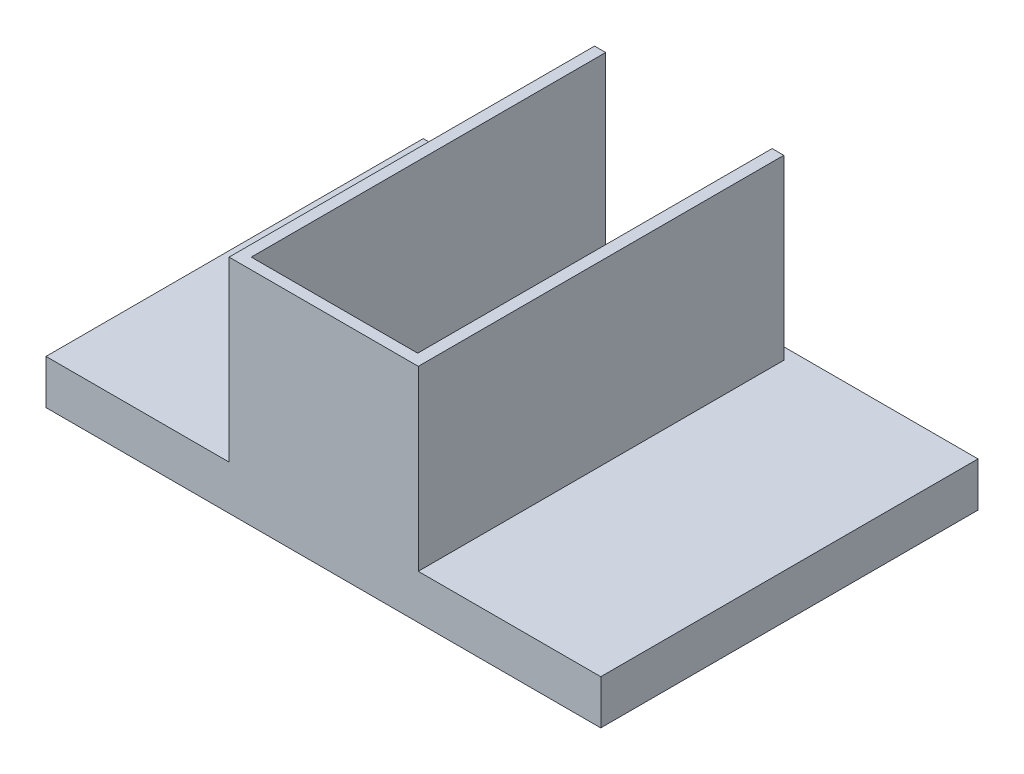
ISO-10303-21;
HEADER;
FILE_DESCRIPTION(('STEP AP214'),'2;1');
FILE_NAME('part.step','',(''),(''),'','','');
FILE_SCHEMA(('AUTOMOTIVE_DESIGN { 1 0 10303 214 1 1 1 1 }'));
ENDSEC;
DATA;
#1=APPLICATION_CONTEXT('core data for automotive mechanical design processes');
#2=APPLICATION_PROTOCOL_DEFINITION('international standard','automotive_design',2000,#1);
#3=PRODUCT_CONTEXT('',#1,'mechanical');
#4=PRODUCT('Part','Part','',(#3));
#5=PRODUCT_RELATED_PRODUCT_CATEGORY('part','',(#4));
#6=PRODUCT_DEFINITION_FORMATION('','',#4);
#7=PRODUCT_DEFINITION_CONTEXT('part definition',#1,'design');
#8=PRODUCT_DEFINITION('design','',#6,#7);
#9=PRODUCT_DEFINITION_SHAPE('','',#8);
#10=(LENGTH_UNIT() NAMED_UNIT(*) SI_UNIT(.MILLI.,.METRE.));
#11=(NAMED_UNIT(*) PLANE_ANGLE_UNIT() SI_UNIT($,.RADIAN.));
#12=(NAMED_UNIT(*) SI_UNIT($,.STERADIAN.) SOLID_ANGLE_UNIT());
#13=UNCERTAINTY_MEASURE_WITH_UNIT(LENGTH_MEASURE(1.E-05),#10,'distance_accuracy_value','');
#14=(GEOMETRIC_REPRESENTATION_CONTEXT(3) GLOBAL_UNCERTAINTY_ASSIGNED_CONTEXT((#13)) GLOBAL_UNIT_ASSIGNED_CONTEXT((#10,
#11,#12)) REPRESENTATION_CONTEXT('',''));
#15=CARTESIAN_POINT('',(0.,0.,0.));
#16=DIRECTION('',(0.,0.,1.));
#17=DIRECTION('',(1.,0.,0.));
#18=AXIS2_PLACEMENT_3D('',#15,#16,#17);
#19=CARTESIAN_POINT('',(-60.7292193154763,5.08,-16.7416663626843));
#20=DIRECTION('',(0.,0.,-1.));
#21=DIRECTION('',(-1.,0.,0.));
#22=AXIS2_PLACEMENT_3D('',#19,#20,#21);
#23=PLANE('',#22);
#24=DIRECTION('',(1.,0.,0.));
#25=VECTOR('',#24,1.);
#26=CARTESIAN_POINT('',(-60.7292193154763,5.08,-16.7416663626843));
#27=LINE('',#26,#25);
#28=CARTESIAN_POINT('',(-60.7292193154763,5.08,-16.7416663626843));
#29=VERTEX_POINT('',#28);
#30=CARTESIAN_POINT('',(2.77078068452374,5.08,-16.7416663626843));
#31=VERTEX_POINT('',#30);
#32=EDGE_CURVE('E125',#29,#31,#27,.T.);
#33=ORIENTED_EDGE('',*,*,#32,.T.);
#34=DIRECTION('',(0.,-1.,0.));
#35=VECTOR('',#34,1.);
#36=CARTESIAN_POINT('',(2.77078068452374,5.08,-16.7416663626843));
#37=LINE('',#36,#35);
#38=CARTESIAN_POINT('',(2.77078068452374,0.,-16.7416663626843));
#39=VERTEX_POINT('',#38);
#40=EDGE_CURVE('E113',#31,#39,#37,.T.);
#41=ORIENTED_EDGE('',*,*,#40,.T.);
#42=DIRECTION('',(1.,0.,0.));
#43=VECTOR('',#42,1.);
#44=CARTESIAN_POINT('',(-60.7292193154763,0.,-16.7416663626843));
#45=LINE('',#44,#43);
#46=CARTESIAN_POINT('',(-60.7292193154763,0.,-16.7416663626843));
#47=VERTEX_POINT('',#46);
#48=EDGE_CURVE('E94',#47,#39,#45,.T.);
#49=ORIENTED_EDGE('',*,*,#48,.F.);
#50=DIRECTION('',(0.,-1.,0.));
#51=VECTOR('',#50,1.);
#52=CARTESIAN_POINT('',(-60.7292193154763,5.08,-16.7416663626843));
#53=LINE('',#52,#51);
#54=EDGE_CURVE('E120',#29,#47,#53,.T.);
#55=ORIENTED_EDGE('',*,*,#54,.F.);
#56=EDGE_LOOP('',(#33,#41,#49,#55));
#57=FACE_BOUND('',#56,.T.);
#58=ADVANCED_FACE('F33',(#57),#23,.T.);
#59=CARTESIAN_POINT('',(0.,5.08,0.));
#60=DIRECTION('',(0.,-1.,0.));
#61=DIRECTION('',(0.,0.,-1.));
#62=AXIS2_PLACEMENT_3D('',#59,#60,#61);
#63=PLANE('',#62);
#64=DIRECTION('',(0.,0.,-1.));
#65=VECTOR('',#64,1.);
#66=CARTESIAN_POINT('',(2.77078068452374,5.08,26.4383336373157));
#67=LINE('',#66,#65);
#68=CARTESIAN_POINT('',(2.77078068452374,5.08,26.4383336373157));
#69=VERTEX_POINT('',#68);
#70=EDGE_CURVE('E89',#69,#31,#67,.T.);
#71=ORIENTED_EDGE('',*,*,#70,.T.);
#72=ORIENTED_EDGE('',*,*,#32,.F.);
#73=DIRECTION('',(0.,0.,1.));
#74=VECTOR('',#73,1.);
#75=CARTESIAN_POINT('',(-60.7292193154763,5.08,26.4383336373157));
#76=LINE('',#75,#74);
#77=CARTESIAN_POINT('',(-60.7292193154763,5.08,26.4383336373157));
#78=VERTEX_POINT('',#77);
#79=EDGE_CURVE('E95',#29,#78,#76,.T.);
#80=ORIENTED_EDGE('',*,*,#79,.T.);
#81=DIRECTION('',(1.,0.,0.));
#82=VECTOR('',#81,1.);
#83=CARTESIAN_POINT('',(-60.7292193154763,5.08,26.4383336373157));
#84=LINE('',#83,#82);
#85=CARTESIAN_POINT('',(-39.7742193154763,5.08,26.4383336373157));
#86=VERTEX_POINT('',#85);
#87=EDGE_CURVE('E101',#78,#86,#84,.T.);
#88=ORIENTED_EDGE('',*,*,#87,.T.);
#89=DIRECTION('',(0.,0.,1.));
#90=VECTOR('',#89,1.);
#91=CARTESIAN_POINT('',(-39.7742193154763,5.08,26.4383336373157));
#92=LINE('',#91,#90);
#93=CARTESIAN_POINT('',(-39.7742193154763,5.08,-15.3995097669461));
#94=VERTEX_POINT('',#93);
#95=EDGE_CURVE('E37',#94,#86,#92,.T.);
#96=ORIENTED_EDGE('',*,*,#95,.F.);
#97=DIRECTION('',(1.,0.,0.));
#98=VECTOR('',#97,1.);
#99=CARTESIAN_POINT('',(-39.7742193154763,5.08,-15.3995097669461));
#100=LINE('',#99,#98);
#101=CARTESIAN_POINT('',(-38.5042193154763,5.08,-15.3995097669461));
#102=VERTEX_POINT('',#101);
#103=EDGE_CURVE('E181',#94,#102,#100,.T.);
#104=ORIENTED_EDGE('',*,*,#103,.T.);
#105=DIRECTION('',(0.,0.,-1.));
#106=VECTOR('',#105,1.);
#107=CARTESIAN_POINT('',(-38.5042193154763,5.08,26.4383336373157));
#108=LINE('',#107,#106);
#109=CARTESIAN_POINT('',(-38.5042193154763,5.08,25.1683336373157));
#110=VERTEX_POINT('',#109);
#111=EDGE_CURVE('E111',#110,#102,#108,.T.);
#112=ORIENTED_EDGE('',*,*,#111,.F.);
#113=DIRECTION('',(1.,0.,0.));
#114=VECTOR('',#113,1.);
#115=CARTESIAN_POINT('',(-38.5042193154763,5.08,25.1683336373157));
#116=LINE('',#115,#114);
#117=CARTESIAN_POINT('',(-19.4542193154763,5.08,25.1683336373157));
#118=VERTEX_POINT('',#117);
#119=EDGE_CURVE('E140',#110,#118,#116,.T.);
#120=ORIENTED_EDGE('',*,*,#119,.T.);
#121=DIRECTION('',(0.,0.,1.));
#122=VECTOR('',#121,1.);
#123=CARTESIAN_POINT('',(-19.4542193154763,5.08,26.4383336373157));
#124=LINE('',#123,#122);
#125=CARTESIAN_POINT('',(-19.4542193154763,5.08,-15.3995097669461));
#126=VERTEX_POINT('',#125);
#127=EDGE_CURVE('E194',#126,#118,#124,.T.);
#128=ORIENTED_EDGE('',*,*,#127,.F.);
#129=CARTESIAN_POINT('',(-18.1182186528872,5.08,-15.3995097669461));
#130=VERTEX_POINT('',#129);
#131=EDGE_CURVE('E177',#126,#130,#100,.T.);
#132=ORIENTED_EDGE('',*,*,#131,.T.);
#133=DIRECTION('',(0.,0.,-1.));
#134=VECTOR('',#133,1.);
#135=CARTESIAN_POINT('',(-18.1182186528872,5.08,26.4383336373157));
#136=LINE('',#135,#134);
#137=CARTESIAN_POINT('',(-18.1182186528872,5.08,26.4383336373157));
#138=VERTEX_POINT('',#137);
#139=EDGE_CURVE('E199',#138,#130,#136,.T.);
#140=ORIENTED_EDGE('',*,*,#139,.F.);
#141=EDGE_CURVE('E59',#138,#69,#84,.T.);
#142=ORIENTED_EDGE('',*,*,#141,.T.);
#143=EDGE_LOOP('',(#71,#72,#80,#88,#96,#104,#112,#120,#128,#132,#140,#142));
#144=FACE_BOUND('',#143,.T.);
#145=ADVANCED_FACE('F211',(#144),#63,.F.);
#146=CARTESIAN_POINT('',(-60.7292193154763,5.08,26.4383336373157));
#147=DIRECTION('',(1.,0.,0.));
#148=DIRECTION('',(0.,0.,-1.));
#149=AXIS2_PLACEMENT_3D('',#146,#147,#148);
#150=PLANE('',#149);
#151=DIRECTION('',(0.,0.,1.));
#152=VECTOR('',#151,1.);
#153=CARTESIAN_POINT('',(-60.7292193154763,0.,26.4383336373157));
#154=LINE('',#153,#152);
#155=CARTESIAN_POINT('',(-60.7292193154763,0.,26.4383336373157));
#156=VERTEX_POINT('',#155);
#157=EDGE_CURVE('E81',#47,#156,#154,.T.);
#158=ORIENTED_EDGE('',*,*,#157,.T.);
#159=DIRECTION('',(0.,-1.,0.));
#160=VECTOR('',#159,1.);
#161=CARTESIAN_POINT('',(-60.7292193154763,5.08,26.4383336373157));
#162=LINE('',#161,#160);
#163=EDGE_CURVE('E11',#78,#156,#162,.T.);
#164=ORIENTED_EDGE('',*,*,#163,.F.);
#165=ORIENTED_EDGE('',*,*,#79,.F.);
#166=ORIENTED_EDGE('',*,*,#54,.T.);
#167=EDGE_LOOP('',(#158,#164,#165,#166));
#168=FACE_BOUND('',#167,.T.);
#169=ADVANCED_FACE('F35',(#168),#150,.F.);
#170=CARTESIAN_POINT('',(-60.7292193154763,5.08,26.4383336373157));
#171=DIRECTION('',(0.,0.,-1.));
#172=DIRECTION('',(-1.,0.,0.));
#173=AXIS2_PLACEMENT_3D('',#170,#171,#172);
#174=PLANE('',#173);
#175=ORIENTED_EDGE('',*,*,#141,.F.);
#176=DIRECTION('',(0.,-1.,0.));
#177=VECTOR('',#176,1.);
#178=CARTESIAN_POINT('',(-18.1182186528872,25.4,26.4383336373157));
#179=LINE('',#178,#177);
#180=CARTESIAN_POINT('',(-18.1182186528872,25.4,26.4383336373157));
#181=VERTEX_POINT('',#180);
#182=EDGE_CURVE('E154',#181,#138,#179,.T.);
#183=ORIENTED_EDGE('',*,*,#182,.F.);
#184=DIRECTION('',(-1.,0.,0.));
#185=VECTOR('',#184,1.);
#186=CARTESIAN_POINT('',(-38.5042193154763,25.4,26.4383336373157));
#187=LINE('',#186,#185);
#188=CARTESIAN_POINT('',(-39.7742193154763,25.4,26.4383336373157));
#189=VERTEX_POINT('',#188);
#190=EDGE_CURVE('E137',#181,#189,#187,.T.);
#191=ORIENTED_EDGE('',*,*,#190,.T.);
#192=DIRECTION('',(0.,-1.,0.));
#193=VECTOR('',#192,1.);
#194=CARTESIAN_POINT('',(-39.7742193154763,25.4,26.4383336373157));
#195=LINE('',#194,#193);
#196=EDGE_CURVE('E134',#189,#86,#195,.T.);
#197=ORIENTED_EDGE('',*,*,#196,.T.);
#198=ORIENTED_EDGE('',*,*,#87,.F.);
#199=ORIENTED_EDGE('',*,*,#163,.T.);
#200=DIRECTION('',(1.,0.,0.));
#201=VECTOR('',#200,1.);
#202=CARTESIAN_POINT('',(-60.7292193154763,0.,26.4383336373157));
#203=LINE('',#202,#201);
#204=CARTESIAN_POINT('',(2.77078068452374,0.,26.4383336373157));
#205=VERTEX_POINT('',#204);
#206=EDGE_CURVE('E71',#156,#205,#203,.T.);
#207=ORIENTED_EDGE('',*,*,#206,.T.);
#208=DIRECTION('',(0.,-1.,0.));
#209=VECTOR('',#208,1.);
#210=CARTESIAN_POINT('',(2.77078068452374,5.08,26.4383336373157));
#211=LINE('',#210,#209);
#212=EDGE_CURVE('E43',#69,#205,#211,.T.);
#213=ORIENTED_EDGE('',*,*,#212,.F.);
#214=EDGE_LOOP('',(#175,#183,#191,#197,#198,#199,#207,#213));
#215=FACE_BOUND('',#214,.T.);
#216=ADVANCED_FACE('F73',(#215),#174,.F.);
#217=CARTESIAN_POINT('',(2.77078068452374,5.08,26.4383336373157));
#218=DIRECTION('',(-1.,0.,0.));
#219=DIRECTION('',(0.,0.,1.));
#220=AXIS2_PLACEMENT_3D('',#217,#218,#219);
#221=PLANE('',#220);
#222=DIRECTION('',(0.,0.,-1.));
#223=VECTOR('',#222,1.);
#224=CARTESIAN_POINT('',(2.77078068452374,0.,26.4383336373157));
#225=LINE('',#224,#223);
#226=EDGE_CURVE('E80',#205,#39,#225,.T.);
#227=ORIENTED_EDGE('',*,*,#226,.T.);
#228=ORIENTED_EDGE('',*,*,#40,.F.);
#229=ORIENTED_EDGE('',*,*,#70,.F.);
#230=ORIENTED_EDGE('',*,*,#212,.T.);
#231=EDGE_LOOP('',(#227,#228,#229,#230));
#232=FACE_BOUND('',#231,.T.);
#233=ADVANCED_FACE('F85',(#232),#221,.F.);
#234=CARTESIAN_POINT('',(0.,0.,0.));
#235=DIRECTION('',(0.,-1.,0.));
#236=DIRECTION('',(0.,0.,-1.));
#237=AXIS2_PLACEMENT_3D('',#234,#235,#236);
#238=PLANE('',#237);
#239=ORIENTED_EDGE('',*,*,#157,.F.);
#240=ORIENTED_EDGE('',*,*,#48,.T.);
#241=ORIENTED_EDGE('',*,*,#226,.F.);
#242=ORIENTED_EDGE('',*,*,#206,.F.);
#243=EDGE_LOOP('',(#239,#240,#241,#242));
#244=FACE_BOUND('',#243,.T.);
#245=ADVANCED_FACE('F92',(#244),#238,.T.);
#246=CARTESIAN_POINT('',(-38.5042193154763,25.4,25.1683336373157));
#247=DIRECTION('',(0.,1.,0.));
#248=DIRECTION('',(-1.,0.,0.));
#249=AXIS2_PLACEMENT_3D('',#246,#247,#248);
#250=PLANE('',#249);
#251=DIRECTION('',(1.,0.,0.));
#252=VECTOR('',#251,1.);
#253=CARTESIAN_POINT('',(-39.7742193154763,25.4,-15.3995097669461));
#254=LINE('',#253,#252);
#255=CARTESIAN_POINT('',(-39.7742193154763,25.4,-15.3995097669461));
#256=VERTEX_POINT('',#255);
#257=CARTESIAN_POINT('',(-38.5042193154763,25.4,-15.3995097669461));
#258=VERTEX_POINT('',#257);
#259=EDGE_CURVE('E172',#256,#258,#254,.T.);
#260=ORIENTED_EDGE('',*,*,#259,.F.);
#261=DIRECTION('',(0.,0.,1.));
#262=VECTOR('',#261,1.);
#263=CARTESIAN_POINT('',(-39.7742193154763,25.4,26.4383336373157));
#264=LINE('',#263,#262);
#265=EDGE_CURVE('E131',#256,#189,#264,.T.);
#266=ORIENTED_EDGE('',*,*,#265,.T.);
#267=ORIENTED_EDGE('',*,*,#190,.F.);
#268=DIRECTION('',(0.,0.,-1.));
#269=VECTOR('',#268,1.);
#270=CARTESIAN_POINT('',(-18.1182186528872,25.4,26.4383336373157));
#271=LINE('',#270,#269);
#272=CARTESIAN_POINT('',(-18.1182186528872,25.4,-15.3995097669461));
#273=VERTEX_POINT('',#272);
#274=EDGE_CURVE('E198',#181,#273,#271,.T.);
#275=ORIENTED_EDGE('',*,*,#274,.T.);
#276=CARTESIAN_POINT('',(-19.4542193154763,25.4,-15.3995097669461));
#277=VERTEX_POINT('',#276);
#278=EDGE_CURVE('E178',#277,#273,#254,.T.);
#279=ORIENTED_EDGE('',*,*,#278,.F.);
#280=DIRECTION('',(0.,0.,1.));
#281=VECTOR('',#280,1.);
#282=CARTESIAN_POINT('',(-19.4542193154763,25.4,26.4383336373157));
#283=LINE('',#282,#281);
#284=CARTESIAN_POINT('',(-19.4542193154763,25.4,25.1683336373157));
#285=VERTEX_POINT('',#284);
#286=EDGE_CURVE('E195',#277,#285,#283,.T.);
#287=ORIENTED_EDGE('',*,*,#286,.T.);
#288=DIRECTION('',(-1.,0.,0.));
#289=VECTOR('',#288,1.);
#290=CARTESIAN_POINT('',(-38.5042193154763,25.4,25.1683336373157));
#291=LINE('',#290,#289);
#292=CARTESIAN_POINT('',(-38.5042193154763,25.4,25.1683336373157));
#293=VERTEX_POINT('',#292);
#294=EDGE_CURVE('E146',#285,#293,#291,.T.);
#295=ORIENTED_EDGE('',*,*,#294,.T.);
#296=DIRECTION('',(0.,0.,-1.));
#297=VECTOR('',#296,1.);
#298=CARTESIAN_POINT('',(-38.5042193154763,25.4,26.4383336373157));
#299=LINE('',#298,#297);
#300=EDGE_CURVE('E119',#293,#258,#299,.T.);
#301=ORIENTED_EDGE('',*,*,#300,.T.);
#302=EDGE_LOOP('',(#260,#266,#267,#275,#279,#287,#295,#301));
#303=FACE_BOUND('',#302,.T.);
#304=ADVANCED_FACE('F170',(#303),#250,.T.);
#305=CARTESIAN_POINT('',(0.,0.,25.1683336373157));
#306=DIRECTION('',(0.,0.,-1.));
#307=DIRECTION('',(-1.,0.,0.));
#308=AXIS2_PLACEMENT_3D('',#305,#306,#307);
#309=PLANE('',#308);
#310=DIRECTION('',(0.,-1.,0.));
#311=VECTOR('',#310,1.);
#312=CARTESIAN_POINT('',(-38.5042193154763,5.08,25.1683336373157));
#313=LINE('',#312,#311);
#314=EDGE_CURVE('E138',#293,#110,#313,.T.);
#315=ORIENTED_EDGE('',*,*,#314,.F.);
#316=ORIENTED_EDGE('',*,*,#294,.F.);
#317=DIRECTION('',(0.,1.,0.));
#318=VECTOR('',#317,1.);
#319=CARTESIAN_POINT('',(-19.4542193154763,5.08,25.1683336373157));
#320=LINE('',#319,#318);
#321=EDGE_CURVE('E143',#118,#285,#320,.T.);
#322=ORIENTED_EDGE('',*,*,#321,.F.);
#323=ORIENTED_EDGE('',*,*,#119,.F.);
#324=EDGE_LOOP('',(#315,#316,#322,#323));
#325=FACE_BOUND('',#324,.T.);
#326=ADVANCED_FACE('F249',(#325),#309,.T.);
#327=CARTESIAN_POINT('',(-38.5042193154763,25.4,26.4383336373157));
#328=DIRECTION('',(-1.,0.,0.));
#329=DIRECTION('',(0.,0.,1.));
#330=AXIS2_PLACEMENT_3D('',#327,#328,#329);
#331=PLANE('',#330);
#332=ORIENTED_EDGE('',*,*,#111,.T.);
#333=DIRECTION('',(0.,1.,0.));
#334=VECTOR('',#333,1.);
#335=CARTESIAN_POINT('',(-38.5042193154763,25.4,-15.3995097669461));
#336=LINE('',#335,#334);
#337=EDGE_CURVE('E192',#102,#258,#336,.T.);
#338=ORIENTED_EDGE('',*,*,#337,.T.);
#339=ORIENTED_EDGE('',*,*,#300,.F.);
#340=ORIENTED_EDGE('',*,*,#314,.T.);
#341=EDGE_LOOP('',(#332,#338,#339,#340));
#342=FACE_BOUND('',#341,.T.);
#343=ADVANCED_FACE('F258',(#342),#331,.F.);
#344=CARTESIAN_POINT('',(-39.7742193154763,25.4,26.4383336373157));
#345=DIRECTION('',(1.,0.,0.));
#346=DIRECTION('',(0.,0.,-1.));
#347=AXIS2_PLACEMENT_3D('',#344,#345,#346);
#348=PLANE('',#347);
#349=ORIENTED_EDGE('',*,*,#265,.F.);
#350=DIRECTION('',(0.,1.,0.));
#351=VECTOR('',#350,1.);
#352=CARTESIAN_POINT('',(-39.7742193154763,5.08,-15.3995097669461));
#353=LINE('',#352,#351);
#354=EDGE_CURVE('E166',#94,#256,#353,.T.);
#355=ORIENTED_EDGE('',*,*,#354,.F.);
#356=ORIENTED_EDGE('',*,*,#95,.T.);
#357=ORIENTED_EDGE('',*,*,#196,.F.);
#358=EDGE_LOOP('',(#349,#355,#356,#357));
#359=FACE_BOUND('',#358,.T.);
#360=ADVANCED_FACE('F162',(#359),#348,.F.);
#361=CARTESIAN_POINT('',(-19.4542193154763,25.4,26.4383336373157));
#362=DIRECTION('',(1.,0.,0.));
#363=DIRECTION('',(0.,0.,-1.));
#364=AXIS2_PLACEMENT_3D('',#361,#362,#363);
#365=PLANE('',#364);
#366=ORIENTED_EDGE('',*,*,#286,.F.);
#367=DIRECTION('',(0.,-1.,0.));
#368=VECTOR('',#367,1.);
#369=CARTESIAN_POINT('',(-19.4542193154763,25.4,-15.3995097669461));
#370=LINE('',#369,#368);
#371=EDGE_CURVE('E188',#277,#126,#370,.T.);
#372=ORIENTED_EDGE('',*,*,#371,.T.);
#373=ORIENTED_EDGE('',*,*,#127,.T.);
#374=ORIENTED_EDGE('',*,*,#321,.T.);
#375=EDGE_LOOP('',(#366,#372,#373,#374));
#376=FACE_BOUND('',#375,.T.);
#377=ADVANCED_FACE('F274',(#376),#365,.F.);
#378=CARTESIAN_POINT('',(-18.1182186528872,25.4,26.4383336373157));
#379=DIRECTION('',(-1.,0.,0.));
#380=DIRECTION('',(0.,0.,1.));
#381=AXIS2_PLACEMENT_3D('',#378,#379,#380);
#382=PLANE('',#381);
#383=ORIENTED_EDGE('',*,*,#139,.T.);
#384=DIRECTION('',(0.,1.,0.));
#385=VECTOR('',#384,1.);
#386=CARTESIAN_POINT('',(-18.1182186528872,5.08,-15.3995097669461));
#387=LINE('',#386,#385);
#388=EDGE_CURVE('E185',#130,#273,#387,.T.);
#389=ORIENTED_EDGE('',*,*,#388,.T.);
#390=ORIENTED_EDGE('',*,*,#274,.F.);
#391=ORIENTED_EDGE('',*,*,#182,.T.);
#392=EDGE_LOOP('',(#383,#389,#390,#391));
#393=FACE_BOUND('',#392,.T.);
#394=ADVANCED_FACE('F283',(#393),#382,.F.);
#395=CARTESIAN_POINT('',(-39.7742193154763,5.08,-15.3995097669461));
#396=DIRECTION('',(0.,0.,1.));
#397=DIRECTION('',(1.,0.,0.));
#398=AXIS2_PLACEMENT_3D('',#395,#396,#397);
#399=PLANE('',#398);
#400=ORIENTED_EDGE('',*,*,#103,.F.);
#401=ORIENTED_EDGE('',*,*,#354,.T.);
#402=ORIENTED_EDGE('',*,*,#259,.T.);
#403=ORIENTED_EDGE('',*,*,#337,.F.);
#404=EDGE_LOOP('',(#400,#401,#402,#403));
#405=FACE_BOUND('',#404,.T.);
#406=ADVANCED_FACE('F292',(#405),#399,.F.);
#407=ORIENTED_EDGE('',*,*,#278,.T.);
#408=ORIENTED_EDGE('',*,*,#388,.F.);
#409=ORIENTED_EDGE('',*,*,#131,.F.);
#410=ORIENTED_EDGE('',*,*,#371,.F.);
#411=EDGE_LOOP('',(#407,#408,#409,#410));
#412=FACE_BOUND('',#411,.T.);
#413=ADVANCED_FACE('F323',(#412),#399,.F.);
#414=CLOSED_SHELL('',(#58,#145,#169,#216,#233,#245,#304,#326,#343,#360,#377,#394,#406,#413));
#415=MANIFOLD_SOLID_BREP('B2',#414);
#416=ADVANCED_BREP_SHAPE_REPRESENTATION('',(#18,#415),#14);
#417=SHAPE_DEFINITION_REPRESENTATION(#9,#416);
ENDSEC;
END-ISO-10303-21;
